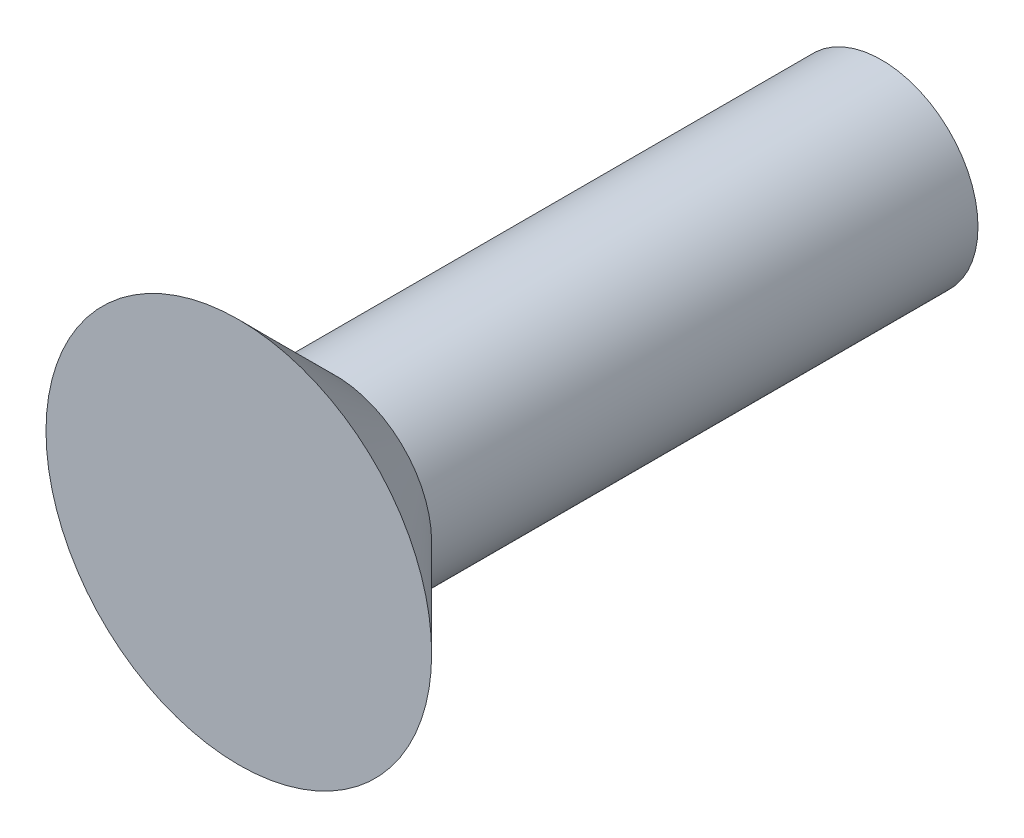
ISO-10303-21;
HEADER;
FILE_DESCRIPTION(('STEP AP214'),'2;1');
FILE_NAME('part.step','',(''),(''),'','','');
FILE_SCHEMA(('AUTOMOTIVE_DESIGN { 1 0 10303 214 1 1 1 1 }'));
ENDSEC;
DATA;
#1=APPLICATION_CONTEXT('core data for automotive mechanical design processes');
#2=APPLICATION_PROTOCOL_DEFINITION('international standard','automotive_design',2000,#1);
#3=PRODUCT_CONTEXT('',#1,'mechanical');
#4=PRODUCT('Part','Part','',(#3));
#5=PRODUCT_RELATED_PRODUCT_CATEGORY('part','',(#4));
#6=PRODUCT_DEFINITION_FORMATION('','',#4);
#7=PRODUCT_DEFINITION_CONTEXT('part definition',#1,'design');
#8=PRODUCT_DEFINITION('design','',#6,#7);
#9=PRODUCT_DEFINITION_SHAPE('','',#8);
#10=(LENGTH_UNIT() NAMED_UNIT(*) SI_UNIT(.MILLI.,.METRE.));
#11=(NAMED_UNIT(*) PLANE_ANGLE_UNIT() SI_UNIT($,.RADIAN.));
#12=(NAMED_UNIT(*) SI_UNIT($,.STERADIAN.) SOLID_ANGLE_UNIT());
#13=UNCERTAINTY_MEASURE_WITH_UNIT(LENGTH_MEASURE(1.E-05),#10,'distance_accuracy_value','');
#14=(GEOMETRIC_REPRESENTATION_CONTEXT(3) GLOBAL_UNCERTAINTY_ASSIGNED_CONTEXT((#13)) GLOBAL_UNIT_ASSIGNED_CONTEXT((#10,
#11,#12)) REPRESENTATION_CONTEXT('',''));
#15=CARTESIAN_POINT('',(0.,0.,0.));
#16=DIRECTION('',(0.,0.,1.));
#17=DIRECTION('',(1.,0.,0.));
#18=AXIS2_PLACEMENT_3D('',#15,#16,#17);
#19=CARTESIAN_POINT('',(0.,0.,-1.5));
#20=DIRECTION('',(0.,0.,-1.));
#21=DIRECTION('',(-1.,0.,0.));
#22=AXIS2_PLACEMENT_3D('',#19,#20,#21);
#23=CYLINDRICAL_SURFACE('',#22,1.5);
#24=CARTESIAN_POINT('',(0.,0.,-1.5));
#25=DIRECTION('',(0.,0.,1.));
#26=DIRECTION('',(1.,0.,0.));
#27=AXIS2_PLACEMENT_3D('',#24,#25,#26);
#28=CIRCLE('',#27,1.5);
#29=CARTESIAN_POINT('',(1.5,0.,-1.5));
#30=VERTEX_POINT('',#29);
#31=EDGE_CURVE('E10',#30,#30,#28,.T.);
#32=ORIENTED_EDGE('',*,*,#31,.F.);
#33=EDGE_LOOP('',(#32));
#34=FACE_BOUND('',#33,.T.);
#35=CARTESIAN_POINT('',(0.,0.,-10.));
#36=DIRECTION('',(0.,0.,1.));
#37=DIRECTION('',(1.,0.,0.));
#38=AXIS2_PLACEMENT_3D('',#35,#36,#37);
#39=CIRCLE('',#38,1.5);
#40=CARTESIAN_POINT('',(1.5,0.,-10.));
#41=VERTEX_POINT('',#40);
#42=EDGE_CURVE('E44',#41,#41,#39,.T.);
#43=ORIENTED_EDGE('',*,*,#42,.T.);
#44=EDGE_LOOP('',(#43));
#45=FACE_BOUND('',#44,.T.);
#46=ADVANCED_FACE('F41',(#34,#45),#23,.T.);
#47=CARTESIAN_POINT('',(0.,0.,-10.));
#48=DIRECTION('',(0.,0.,1.));
#49=DIRECTION('',(1.,0.,0.));
#50=AXIS2_PLACEMENT_3D('',#47,#48,#49);
#51=PLANE('',#50);
#52=ORIENTED_EDGE('',*,*,#42,.F.);
#53=EDGE_LOOP('',(#52));
#54=FACE_BOUND('',#53,.T.);
#55=ADVANCED_FACE('F60',(#54),#51,.F.);
#56=CARTESIAN_POINT('',(0.,0.,-1.5));
#57=DIRECTION('',(0.,0.,1.));
#58=DIRECTION('',(1.,0.,0.));
#59=AXIS2_PLACEMENT_3D('',#56,#57,#58);
#60=CONICAL_SURFACE('',#59,1.5,0.785398163397448);
#61=CARTESIAN_POINT('',(0.,0.,0.));
#62=DIRECTION('',(0.,0.,1.));
#63=DIRECTION('',(1.,0.,0.));
#64=AXIS2_PLACEMENT_3D('',#61,#62,#63);
#65=CIRCLE('',#64,3.);
#66=CARTESIAN_POINT('',(3.,0.,0.));
#67=VERTEX_POINT('',#66);
#68=EDGE_CURVE('E51',#67,#67,#65,.T.);
#69=ORIENTED_EDGE('',*,*,#68,.F.);
#70=EDGE_LOOP('',(#69));
#71=FACE_BOUND('',#70,.T.);
#72=ORIENTED_EDGE('',*,*,#31,.T.);
#73=EDGE_LOOP('',(#72));
#74=FACE_BOUND('',#73,.T.);
#75=ADVANCED_FACE('F58',(#71,#74),#60,.T.);
#76=CARTESIAN_POINT('',(0.,0.,0.));
#77=DIRECTION('',(0.,0.,1.));
#78=DIRECTION('',(1.,0.,0.));
#79=AXIS2_PLACEMENT_3D('',#76,#77,#78);
#80=PLANE('',#79);
#81=ORIENTED_EDGE('',*,*,#68,.T.);
#82=EDGE_LOOP('',(#81));
#83=FACE_BOUND('',#82,.T.);
#84=ADVANCED_FACE('F56',(#83),#80,.T.);
#85=CLOSED_SHELL('',(#46,#55,#75,#84));
#86=MANIFOLD_SOLID_BREP('B2',#85);
#87=ADVANCED_BREP_SHAPE_REPRESENTATION('',(#18,#86),#14);
#88=SHAPE_DEFINITION_REPRESENTATION(#9,#87);
ENDSEC;
END-ISO-10303-21;
